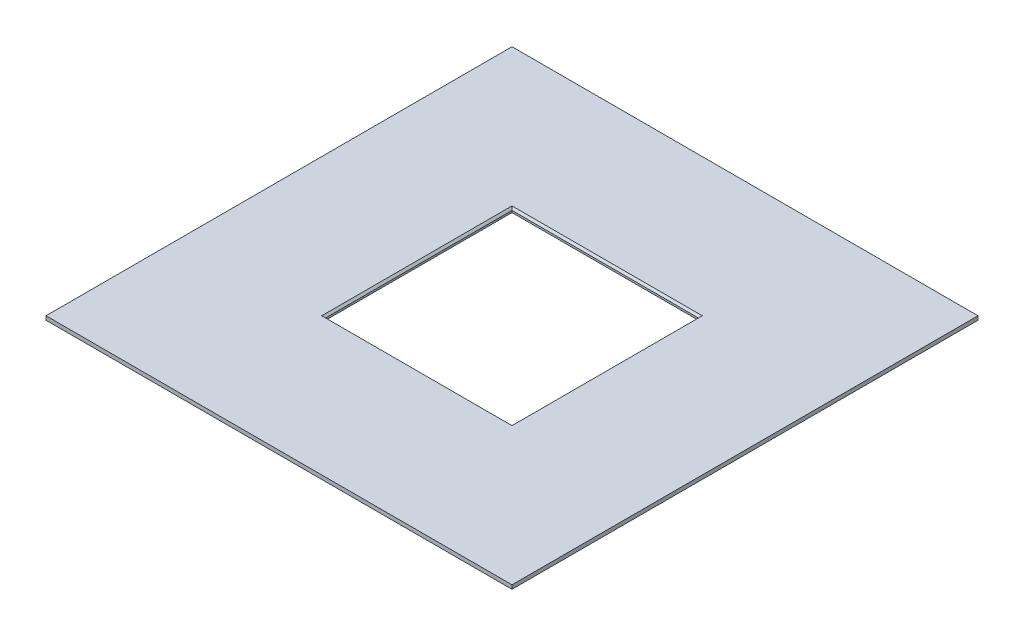
ISO-10303-21;
HEADER;
FILE_DESCRIPTION(('STEP AP214'),'2;1');
FILE_NAME('part.step','',(''),(''),'','','');
FILE_SCHEMA(('AUTOMOTIVE_DESIGN { 1 0 10303 214 1 1 1 1 }'));
ENDSEC;
DATA;
#1=APPLICATION_CONTEXT('core data for automotive mechanical design processes');
#2=APPLICATION_PROTOCOL_DEFINITION('international standard','automotive_design',2000,#1);
#3=PRODUCT_CONTEXT('',#1,'mechanical');
#4=PRODUCT('Part','Part','',(#3));
#5=PRODUCT_RELATED_PRODUCT_CATEGORY('part','',(#4));
#6=PRODUCT_DEFINITION_FORMATION('','',#4);
#7=PRODUCT_DEFINITION_CONTEXT('part definition',#1,'design');
#8=PRODUCT_DEFINITION('design','',#6,#7);
#9=PRODUCT_DEFINITION_SHAPE('','',#8);
#10=(LENGTH_UNIT() NAMED_UNIT(*) SI_UNIT(.MILLI.,.METRE.));
#11=(NAMED_UNIT(*) PLANE_ANGLE_UNIT() SI_UNIT($,.RADIAN.));
#12=(NAMED_UNIT(*) SI_UNIT($,.STERADIAN.) SOLID_ANGLE_UNIT());
#13=UNCERTAINTY_MEASURE_WITH_UNIT(LENGTH_MEASURE(1.E-05),#10,'distance_accuracy_value','');
#14=(GEOMETRIC_REPRESENTATION_CONTEXT(3) GLOBAL_UNCERTAINTY_ASSIGNED_CONTEXT((#13)) GLOBAL_UNIT_ASSIGNED_CONTEXT((#10,
#11,#12)) REPRESENTATION_CONTEXT('',''));
#15=CARTESIAN_POINT('',(0.,0.,0.));
#16=DIRECTION('',(0.,0.,1.));
#17=DIRECTION('',(1.,0.,0.));
#18=AXIS2_PLACEMENT_3D('',#15,#16,#17);
#19=CARTESIAN_POINT('',(0.,1.,0.));
#20=DIRECTION('',(0.,1.,0.));
#21=DIRECTION('',(0.,0.,1.));
#22=AXIS2_PLACEMENT_3D('',#19,#20,#21);
#23=PLANE('',#22);
#24=DIRECTION('',(1.,0.,0.));
#25=VECTOR('',#24,1.);
#26=CARTESIAN_POINT('',(0.,1.,-24.5));
#27=LINE('',#26,#25);
#28=CARTESIAN_POINT('',(-24.5,1.,-24.5));
#29=VERTEX_POINT('',#28);
#30=CARTESIAN_POINT('',(24.5,1.,-24.5));
#31=VERTEX_POINT('',#30);
#32=EDGE_CURVE('E205',#29,#31,#27,.T.);
#33=ORIENTED_EDGE('',*,*,#32,.T.);
#34=DIRECTION('',(0.,0.,1.));
#35=VECTOR('',#34,1.);
#36=CARTESIAN_POINT('',(24.5,1.,0.));
#37=LINE('',#36,#35);
#38=CARTESIAN_POINT('',(24.5,1.,24.5));
#39=VERTEX_POINT('',#38);
#40=EDGE_CURVE('E214',#31,#39,#37,.T.);
#41=ORIENTED_EDGE('',*,*,#40,.T.);
#42=DIRECTION('',(-1.,0.,0.));
#43=VECTOR('',#42,1.);
#44=CARTESIAN_POINT('',(0.,1.,24.5));
#45=LINE('',#44,#43);
#46=CARTESIAN_POINT('',(-24.5,1.,24.5));
#47=VERTEX_POINT('',#46);
#48=EDGE_CURVE('E211',#39,#47,#45,.T.);
#49=ORIENTED_EDGE('',*,*,#48,.T.);
#50=DIRECTION('',(0.,0.,-1.));
#51=VECTOR('',#50,1.);
#52=CARTESIAN_POINT('',(-24.5,1.,0.));
#53=LINE('',#52,#51);
#54=EDGE_CURVE('E208',#47,#29,#53,.T.);
#55=ORIENTED_EDGE('',*,*,#54,.T.);
#56=EDGE_LOOP('',(#33,#41,#49,#55));
#57=FACE_BOUND('',#56,.T.);
#58=DIRECTION('',(0.,0.,-1.));
#59=VECTOR('',#58,1.);
#60=CARTESIAN_POINT('',(60.,1.,-60.));
#61=LINE('',#60,#59);
#62=CARTESIAN_POINT('',(60.,1.,60.));
#63=VERTEX_POINT('',#62);
#64=CARTESIAN_POINT('',(60.,1.,-60.));
#65=VERTEX_POINT('',#64);
#66=EDGE_CURVE('E162',#63,#65,#61,.T.);
#67=ORIENTED_EDGE('',*,*,#66,.T.);
#68=DIRECTION('',(-1.,0.,0.));
#69=VECTOR('',#68,1.);
#70=CARTESIAN_POINT('',(-60.,1.,-60.));
#71=LINE('',#70,#69);
#72=CARTESIAN_POINT('',(-60.,1.,-60.));
#73=VERTEX_POINT('',#72);
#74=EDGE_CURVE('E166',#65,#73,#71,.T.);
#75=ORIENTED_EDGE('',*,*,#74,.T.);
#76=DIRECTION('',(0.,0.,1.));
#77=VECTOR('',#76,1.);
#78=CARTESIAN_POINT('',(-60.,1.,-60.));
#79=LINE('',#78,#77);
#80=CARTESIAN_POINT('',(-60.,1.,60.));
#81=VERTEX_POINT('',#80);
#82=EDGE_CURVE('E170',#73,#81,#79,.T.);
#83=ORIENTED_EDGE('',*,*,#82,.T.);
#84=DIRECTION('',(1.,0.,0.));
#85=VECTOR('',#84,1.);
#86=CARTESIAN_POINT('',(-60.,1.,60.));
#87=LINE('',#86,#85);
#88=EDGE_CURVE('E173',#81,#63,#87,.T.);
#89=ORIENTED_EDGE('',*,*,#88,.T.);
#90=EDGE_LOOP('',(#67,#75,#83,#89));
#91=FACE_BOUND('',#90,.T.);
#92=ADVANCED_FACE('F40',(#57,#91),#23,.T.);
#93=CARTESIAN_POINT('',(0.,0.,0.));
#94=DIRECTION('',(0.,1.,0.));
#95=DIRECTION('',(0.,0.,1.));
#96=AXIS2_PLACEMENT_3D('',#93,#94,#95);
#97=PLANE('',#96);
#98=DIRECTION('',(0.,0.,-1.));
#99=VECTOR('',#98,1.);
#100=CARTESIAN_POINT('',(60.,0.,-60.));
#101=LINE('',#100,#99);
#102=CARTESIAN_POINT('',(60.,0.,60.));
#103=VERTEX_POINT('',#102);
#104=CARTESIAN_POINT('',(60.,0.,-60.));
#105=VERTEX_POINT('',#104);
#106=EDGE_CURVE('E129',#103,#105,#101,.T.);
#107=ORIENTED_EDGE('',*,*,#106,.F.);
#108=DIRECTION('',(1.,0.,0.));
#109=VECTOR('',#108,1.);
#110=CARTESIAN_POINT('',(-60.,0.,60.));
#111=LINE('',#110,#109);
#112=CARTESIAN_POINT('',(-60.,0.,60.));
#113=VERTEX_POINT('',#112);
#114=EDGE_CURVE('E167',#113,#103,#111,.T.);
#115=ORIENTED_EDGE('',*,*,#114,.F.);
#116=DIRECTION('',(0.,0.,1.));
#117=VECTOR('',#116,1.);
#118=CARTESIAN_POINT('',(-60.,0.,-60.));
#119=LINE('',#118,#117);
#120=CARTESIAN_POINT('',(-60.,0.,-60.));
#121=VERTEX_POINT('',#120);
#122=EDGE_CURVE('E183',#121,#113,#119,.T.);
#123=ORIENTED_EDGE('',*,*,#122,.F.);
#124=DIRECTION('',(-1.,0.,0.));
#125=VECTOR('',#124,1.);
#126=CARTESIAN_POINT('',(-60.,0.,-60.));
#127=LINE('',#126,#125);
#128=EDGE_CURVE('E180',#105,#121,#127,.T.);
#129=ORIENTED_EDGE('',*,*,#128,.F.);
#130=EDGE_LOOP('',(#107,#115,#123,#129));
#131=FACE_BOUND('',#130,.T.);
#132=DIRECTION('',(0.,0.,-1.));
#133=VECTOR('',#132,1.);
#134=CARTESIAN_POINT('',(24.,0.,-24.));
#135=LINE('',#134,#133);
#136=CARTESIAN_POINT('',(24.,0.,24.));
#137=VERTEX_POINT('',#136);
#138=CARTESIAN_POINT('',(24.,0.,-24.));
#139=VERTEX_POINT('',#138);
#140=EDGE_CURVE('E124',#137,#139,#135,.T.);
#141=ORIENTED_EDGE('',*,*,#140,.T.);
#142=DIRECTION('',(-1.,0.,0.));
#143=VECTOR('',#142,1.);
#144=CARTESIAN_POINT('',(-24.,0.,-24.));
#145=LINE('',#144,#143);
#146=CARTESIAN_POINT('',(-24.,0.,-24.));
#147=VERTEX_POINT('',#146);
#148=EDGE_CURVE('E133',#139,#147,#145,.T.);
#149=ORIENTED_EDGE('',*,*,#148,.T.);
#150=DIRECTION('',(0.,0.,1.));
#151=VECTOR('',#150,1.);
#152=CARTESIAN_POINT('',(-24.,0.,-24.));
#153=LINE('',#152,#151);
#154=CARTESIAN_POINT('',(-24.,0.,24.));
#155=VERTEX_POINT('',#154);
#156=EDGE_CURVE('E139',#147,#155,#153,.T.);
#157=ORIENTED_EDGE('',*,*,#156,.T.);
#158=DIRECTION('',(1.,0.,0.));
#159=VECTOR('',#158,1.);
#160=CARTESIAN_POINT('',(-24.,0.,24.));
#161=LINE('',#160,#159);
#162=EDGE_CURVE('E143',#155,#137,#161,.T.);
#163=ORIENTED_EDGE('',*,*,#162,.T.);
#164=EDGE_LOOP('',(#141,#149,#157,#163));
#165=FACE_BOUND('',#164,.T.);
#166=ADVANCED_FACE('F141',(#131,#165),#97,.F.);
#167=CARTESIAN_POINT('',(60.,1.,-60.));
#168=DIRECTION('',(-1.,0.,0.));
#169=DIRECTION('',(0.,0.,1.));
#170=AXIS2_PLACEMENT_3D('',#167,#168,#169);
#171=PLANE('',#170);
#172=ORIENTED_EDGE('',*,*,#106,.T.);
#173=DIRECTION('',(0.,-1.,0.));
#174=VECTOR('',#173,1.);
#175=CARTESIAN_POINT('',(60.,1.,-60.));
#176=LINE('',#175,#174);
#177=EDGE_CURVE('E199',#65,#105,#176,.T.);
#178=ORIENTED_EDGE('',*,*,#177,.F.);
#179=ORIENTED_EDGE('',*,*,#66,.F.);
#180=DIRECTION('',(0.,-1.,0.));
#181=VECTOR('',#180,1.);
#182=CARTESIAN_POINT('',(60.,1.,60.));
#183=LINE('',#182,#181);
#184=EDGE_CURVE('E176',#63,#103,#183,.T.);
#185=ORIENTED_EDGE('',*,*,#184,.T.);
#186=EDGE_LOOP('',(#172,#178,#179,#185));
#187=FACE_BOUND('',#186,.T.);
#188=ADVANCED_FACE('F262',(#187),#171,.F.);
#189=CARTESIAN_POINT('',(-60.,1.,-60.));
#190=DIRECTION('',(0.,0.,1.));
#191=DIRECTION('',(1.,0.,0.));
#192=AXIS2_PLACEMENT_3D('',#189,#190,#191);
#193=PLANE('',#192);
#194=ORIENTED_EDGE('',*,*,#128,.T.);
#195=DIRECTION('',(0.,-1.,0.));
#196=VECTOR('',#195,1.);
#197=CARTESIAN_POINT('',(-60.,1.,-60.));
#198=LINE('',#197,#196);
#199=EDGE_CURVE('E195',#73,#121,#198,.T.);
#200=ORIENTED_EDGE('',*,*,#199,.F.);
#201=ORIENTED_EDGE('',*,*,#74,.F.);
#202=ORIENTED_EDGE('',*,*,#177,.T.);
#203=EDGE_LOOP('',(#194,#200,#201,#202));
#204=FACE_BOUND('',#203,.T.);
#205=ADVANCED_FACE('F275',(#204),#193,.F.);
#206=CARTESIAN_POINT('',(-60.,1.,-60.));
#207=DIRECTION('',(1.,0.,0.));
#208=DIRECTION('',(0.,0.,-1.));
#209=AXIS2_PLACEMENT_3D('',#206,#207,#208);
#210=PLANE('',#209);
#211=ORIENTED_EDGE('',*,*,#122,.T.);
#212=DIRECTION('',(0.,-1.,0.));
#213=VECTOR('',#212,1.);
#214=CARTESIAN_POINT('',(-60.,1.,60.));
#215=LINE('',#214,#213);
#216=EDGE_CURVE('E191',#81,#113,#215,.T.);
#217=ORIENTED_EDGE('',*,*,#216,.F.);
#218=ORIENTED_EDGE('',*,*,#82,.F.);
#219=ORIENTED_EDGE('',*,*,#199,.T.);
#220=EDGE_LOOP('',(#211,#217,#218,#219));
#221=FACE_BOUND('',#220,.T.);
#222=ADVANCED_FACE('F271',(#221),#210,.F.);
#223=CARTESIAN_POINT('',(-60.,1.,60.));
#224=DIRECTION('',(0.,0.,-1.));
#225=DIRECTION('',(-1.,0.,0.));
#226=AXIS2_PLACEMENT_3D('',#223,#224,#225);
#227=PLANE('',#226);
#228=ORIENTED_EDGE('',*,*,#114,.T.);
#229=ORIENTED_EDGE('',*,*,#184,.F.);
#230=ORIENTED_EDGE('',*,*,#88,.F.);
#231=ORIENTED_EDGE('',*,*,#216,.T.);
#232=EDGE_LOOP('',(#228,#229,#230,#231));
#233=FACE_BOUND('',#232,.T.);
#234=ADVANCED_FACE('F268',(#233),#227,.F.);
#235=CARTESIAN_POINT('',(24.,1.,-24.));
#236=DIRECTION('',(-1.,0.,0.));
#237=DIRECTION('',(0.,0.,1.));
#238=AXIS2_PLACEMENT_3D('',#235,#236,#237);
#239=PLANE('',#238);
#240=DIRECTION('',(0.,-1.,0.));
#241=VECTOR('',#240,1.);
#242=CARTESIAN_POINT('',(24.,1.,24.));
#243=LINE('',#242,#241);
#244=CARTESIAN_POINT('',(24.,0.5,24.));
#245=VERTEX_POINT('',#244);
#246=EDGE_CURVE('E154',#245,#137,#243,.T.);
#247=ORIENTED_EDGE('',*,*,#246,.F.);
#248=DIRECTION('',(0.,0.,-1.));
#249=VECTOR('',#248,1.);
#250=CARTESIAN_POINT('',(24.,0.5,-24.));
#251=LINE('',#250,#249);
#252=CARTESIAN_POINT('',(24.,0.5,-24.));
#253=VERTEX_POINT('',#252);
#254=EDGE_CURVE('E127',#245,#253,#251,.T.);
#255=ORIENTED_EDGE('',*,*,#254,.T.);
#256=DIRECTION('',(0.,-1.,0.));
#257=VECTOR('',#256,1.);
#258=CARTESIAN_POINT('',(24.,1.,-24.));
#259=LINE('',#258,#257);
#260=EDGE_CURVE('E119',#253,#139,#259,.T.);
#261=ORIENTED_EDGE('',*,*,#260,.T.);
#262=ORIENTED_EDGE('',*,*,#140,.F.);
#263=EDGE_LOOP('',(#247,#255,#261,#262));
#264=FACE_BOUND('',#263,.T.);
#265=ADVANCED_FACE('F122',(#264),#239,.T.);
#266=CARTESIAN_POINT('',(-24.,1.,-24.));
#267=DIRECTION('',(0.,0.,1.));
#268=DIRECTION('',(1.,0.,0.));
#269=AXIS2_PLACEMENT_3D('',#266,#267,#268);
#270=PLANE('',#269);
#271=ORIENTED_EDGE('',*,*,#260,.F.);
#272=DIRECTION('',(-1.,0.,0.));
#273=VECTOR('',#272,1.);
#274=CARTESIAN_POINT('',(-24.,0.5,-24.));
#275=LINE('',#274,#273);
#276=CARTESIAN_POINT('',(-24.,0.5,-24.));
#277=VERTEX_POINT('',#276);
#278=EDGE_CURVE('E11',#253,#277,#275,.T.);
#279=ORIENTED_EDGE('',*,*,#278,.T.);
#280=DIRECTION('',(0.,-1.,0.));
#281=VECTOR('',#280,1.);
#282=CARTESIAN_POINT('',(-24.,1.,-24.));
#283=LINE('',#282,#281);
#284=EDGE_CURVE('E130',#277,#147,#283,.T.);
#285=ORIENTED_EDGE('',*,*,#284,.T.);
#286=ORIENTED_EDGE('',*,*,#148,.F.);
#287=EDGE_LOOP('',(#271,#279,#285,#286));
#288=FACE_BOUND('',#287,.T.);
#289=ADVANCED_FACE('F134',(#288),#270,.T.);
#290=CARTESIAN_POINT('',(-24.,1.,-24.));
#291=DIRECTION('',(1.,0.,0.));
#292=DIRECTION('',(0.,0.,-1.));
#293=AXIS2_PLACEMENT_3D('',#290,#291,#292);
#294=PLANE('',#293);
#295=ORIENTED_EDGE('',*,*,#284,.F.);
#296=DIRECTION('',(0.,0.,1.));
#297=VECTOR('',#296,1.);
#298=CARTESIAN_POINT('',(-24.,0.5,-24.));
#299=LINE('',#298,#297);
#300=CARTESIAN_POINT('',(-24.,0.5,24.));
#301=VERTEX_POINT('',#300);
#302=EDGE_CURVE('E51',#277,#301,#299,.T.);
#303=ORIENTED_EDGE('',*,*,#302,.T.);
#304=DIRECTION('',(0.,-1.,0.));
#305=VECTOR('',#304,1.);
#306=CARTESIAN_POINT('',(-24.,1.,24.));
#307=LINE('',#306,#305);
#308=EDGE_CURVE('E157',#301,#155,#307,.T.);
#309=ORIENTED_EDGE('',*,*,#308,.T.);
#310=ORIENTED_EDGE('',*,*,#156,.F.);
#311=EDGE_LOOP('',(#295,#303,#309,#310));
#312=FACE_BOUND('',#311,.T.);
#313=ADVANCED_FACE('F245',(#312),#294,.T.);
#314=CARTESIAN_POINT('',(-24.,1.,24.));
#315=DIRECTION('',(0.,0.,-1.));
#316=DIRECTION('',(-1.,0.,0.));
#317=AXIS2_PLACEMENT_3D('',#314,#315,#316);
#318=PLANE('',#317);
#319=ORIENTED_EDGE('',*,*,#308,.F.);
#320=DIRECTION('',(1.,0.,0.));
#321=VECTOR('',#320,1.);
#322=CARTESIAN_POINT('',(-24.,0.5,24.));
#323=LINE('',#322,#321);
#324=EDGE_CURVE('E218',#301,#245,#323,.T.);
#325=ORIENTED_EDGE('',*,*,#324,.T.);
#326=ORIENTED_EDGE('',*,*,#246,.T.);
#327=ORIENTED_EDGE('',*,*,#162,.F.);
#328=EDGE_LOOP('',(#319,#325,#326,#327));
#329=FACE_BOUND('',#328,.T.);
#330=ADVANCED_FACE('F244',(#329),#318,.T.);
#331=CARTESIAN_POINT('',(-24.,0.5,-24.));
#332=DIRECTION('',(-0.707106781186547,-0.707106781186547,0.));
#333=DIRECTION('',(0.,0.,1.));
#334=AXIS2_PLACEMENT_3D('',#331,#332,#333);
#335=PLANE('',#334);
#336=DIRECTION('',(0.577350269189626,-0.577350269189626,0.577350269189626));
#337=VECTOR('',#336,1.);
#338=CARTESIAN_POINT('',(-24.,0.5,-24.));
#339=LINE('',#338,#337);
#340=EDGE_CURVE('E148',#29,#277,#339,.T.);
#341=ORIENTED_EDGE('',*,*,#340,.F.);
#342=ORIENTED_EDGE('',*,*,#54,.F.);
#343=DIRECTION('',(0.577350269189626,-0.577350269189626,-0.577350269189626));
#344=VECTOR('',#343,1.);
#345=CARTESIAN_POINT('',(-24.,0.5,24.));
#346=LINE('',#345,#344);
#347=EDGE_CURVE('E45',#301,#47,#346,.F.);
#348=ORIENTED_EDGE('',*,*,#347,.F.);
#349=ORIENTED_EDGE('',*,*,#302,.F.);
#350=EDGE_LOOP('',(#341,#342,#348,#349));
#351=FACE_BOUND('',#350,.T.);
#352=ADVANCED_FACE('F43',(#351),#335,.F.);
#353=CARTESIAN_POINT('',(-24.,0.5,24.));
#354=DIRECTION('',(0.,-0.707106781186547,0.707106781186547));
#355=DIRECTION('',(1.,0.,0.));
#356=AXIS2_PLACEMENT_3D('',#353,#354,#355);
#357=PLANE('',#356);
#358=ORIENTED_EDGE('',*,*,#347,.T.);
#359=ORIENTED_EDGE('',*,*,#48,.F.);
#360=DIRECTION('',(-0.577350269189626,-0.577350269189626,-0.577350269189626));
#361=VECTOR('',#360,1.);
#362=CARTESIAN_POINT('',(8.00000000000001,-15.5,7.99999999999998));
#363=LINE('',#362,#361);
#364=EDGE_CURVE('E226',#245,#39,#363,.F.);
#365=ORIENTED_EDGE('',*,*,#364,.F.);
#366=ORIENTED_EDGE('',*,*,#324,.F.);
#367=EDGE_LOOP('',(#358,#359,#365,#366));
#368=FACE_BOUND('',#367,.T.);
#369=ADVANCED_FACE('F242',(#368),#357,.F.);
#370=CARTESIAN_POINT('',(-24.,0.5,-24.));
#371=DIRECTION('',(0.,-0.707106781186547,-0.707106781186547));
#372=DIRECTION('',(-1.,0.,0.));
#373=AXIS2_PLACEMENT_3D('',#370,#371,#372);
#374=PLANE('',#373);
#375=ORIENTED_EDGE('',*,*,#340,.T.);
#376=ORIENTED_EDGE('',*,*,#278,.F.);
#377=DIRECTION('',(0.577350269189626,0.577350269189626,-0.577350269189626));
#378=VECTOR('',#377,1.);
#379=CARTESIAN_POINT('',(24.,0.5,-24.));
#380=LINE('',#379,#378);
#381=EDGE_CURVE('E223',#31,#253,#380,.F.);
#382=ORIENTED_EDGE('',*,*,#381,.F.);
#383=ORIENTED_EDGE('',*,*,#32,.F.);
#384=EDGE_LOOP('',(#375,#376,#382,#383));
#385=FACE_BOUND('',#384,.T.);
#386=ADVANCED_FACE('F233',(#385),#374,.F.);
#387=CARTESIAN_POINT('',(24.,0.5,-24.));
#388=DIRECTION('',(0.707106781186547,-0.707106781186547,0.));
#389=DIRECTION('',(0.,0.,-1.));
#390=AXIS2_PLACEMENT_3D('',#387,#388,#389);
#391=PLANE('',#390);
#392=ORIENTED_EDGE('',*,*,#364,.T.);
#393=ORIENTED_EDGE('',*,*,#40,.F.);
#394=ORIENTED_EDGE('',*,*,#381,.T.);
#395=ORIENTED_EDGE('',*,*,#254,.F.);
#396=EDGE_LOOP('',(#392,#393,#394,#395));
#397=FACE_BOUND('',#396,.T.);
#398=ADVANCED_FACE('F284',(#397),#391,.F.);
#399=CLOSED_SHELL('',(#92,#166,#188,#205,#222,#234,#265,#289,#313,#330,#352,#369,#386,#398));
#400=MANIFOLD_SOLID_BREP('B2',#399);
#401=ADVANCED_BREP_SHAPE_REPRESENTATION('',(#18,#400),#14);
#402=SHAPE_DEFINITION_REPRESENTATION(#9,#401);
ENDSEC;
END-ISO-10303-21;
